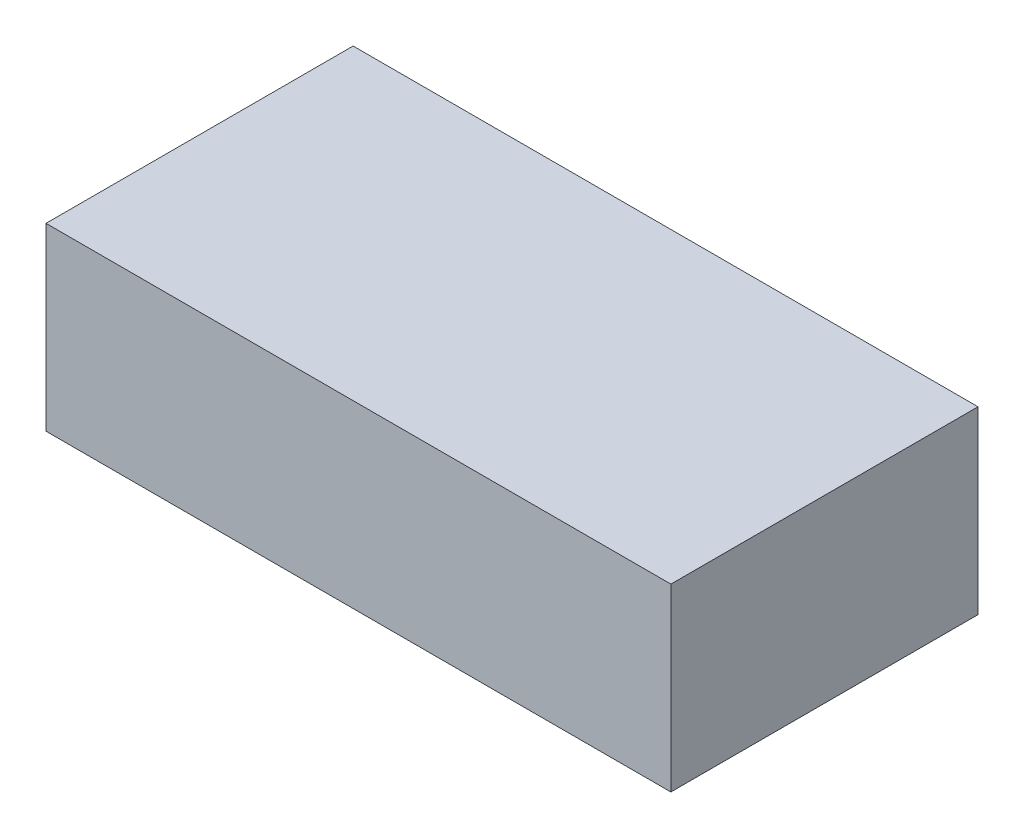
ISO-10303-21;
HEADER;
FILE_DESCRIPTION(('STEP AP214'),'2;1');
FILE_NAME('part.step','',(''),(''),'','','');
FILE_SCHEMA(('AUTOMOTIVE_DESIGN { 1 0 10303 214 1 1 1 1 }'));
ENDSEC;
DATA;
#1=APPLICATION_CONTEXT('core data for automotive mechanical design processes');
#2=APPLICATION_PROTOCOL_DEFINITION('international standard','automotive_design',2000,#1);
#3=PRODUCT_CONTEXT('',#1,'mechanical');
#4=PRODUCT('Part','Part','',(#3));
#5=PRODUCT_RELATED_PRODUCT_CATEGORY('part','',(#4));
#6=PRODUCT_DEFINITION_FORMATION('','',#4);
#7=PRODUCT_DEFINITION_CONTEXT('part definition',#1,'design');
#8=PRODUCT_DEFINITION('design','',#6,#7);
#9=PRODUCT_DEFINITION_SHAPE('','',#8);
#10=(LENGTH_UNIT() NAMED_UNIT(*) SI_UNIT(.MILLI.,.METRE.));
#11=(NAMED_UNIT(*) PLANE_ANGLE_UNIT() SI_UNIT($,.RADIAN.));
#12=(NAMED_UNIT(*) SI_UNIT($,.STERADIAN.) SOLID_ANGLE_UNIT());
#13=UNCERTAINTY_MEASURE_WITH_UNIT(LENGTH_MEASURE(1.E-05),#10,'distance_accuracy_value','');
#14=(GEOMETRIC_REPRESENTATION_CONTEXT(3) GLOBAL_UNCERTAINTY_ASSIGNED_CONTEXT((#13)) GLOBAL_UNIT_ASSIGNED_CONTEXT((#10,
#11,#12)) REPRESENTATION_CONTEXT('',''));
#15=CARTESIAN_POINT('',(0.,0.,0.));
#16=DIRECTION('',(0.,0.,1.));
#17=DIRECTION('',(1.,0.,0.));
#18=AXIS2_PLACEMENT_3D('',#15,#16,#17);
#19=CARTESIAN_POINT('',(59.,34.,29.));
#20=DIRECTION('',(-1.,0.,0.));
#21=DIRECTION('',(0.,0.,1.));
#22=AXIS2_PLACEMENT_3D('',#19,#20,#21);
#23=PLANE('',#22);
#24=DIRECTION('',(0.,0.,-1.));
#25=VECTOR('',#24,1.);
#26=CARTESIAN_POINT('',(59.,0.,29.));
#27=LINE('',#26,#25);
#28=CARTESIAN_POINT('',(59.,0.,29.));
#29=VERTEX_POINT('',#28);
#30=CARTESIAN_POINT('',(59.,0.,-29.));
#31=VERTEX_POINT('',#30);
#32=EDGE_CURVE('E99',#29,#31,#27,.T.);
#33=ORIENTED_EDGE('',*,*,#32,.T.);
#34=DIRECTION('',(0.,-1.,0.));
#35=VECTOR('',#34,1.);
#36=CARTESIAN_POINT('',(59.,34.,-29.));
#37=LINE('',#36,#35);
#38=CARTESIAN_POINT('',(59.,34.,-29.));
#39=VERTEX_POINT('',#38);
#40=EDGE_CURVE('E11',#39,#31,#37,.T.);
#41=ORIENTED_EDGE('',*,*,#40,.F.);
#42=DIRECTION('',(0.,0.,-1.));
#43=VECTOR('',#42,1.);
#44=CARTESIAN_POINT('',(59.,34.,29.));
#45=LINE('',#44,#43);
#46=CARTESIAN_POINT('',(59.,34.,29.));
#47=VERTEX_POINT('',#46);
#48=EDGE_CURVE('E87',#47,#39,#45,.T.);
#49=ORIENTED_EDGE('',*,*,#48,.F.);
#50=DIRECTION('',(0.,-1.,0.));
#51=VECTOR('',#50,1.);
#52=CARTESIAN_POINT('',(59.,34.,29.));
#53=LINE('',#52,#51);
#54=EDGE_CURVE('E95',#47,#29,#53,.T.);
#55=ORIENTED_EDGE('',*,*,#54,.T.);
#56=EDGE_LOOP('',(#33,#41,#49,#55));
#57=FACE_BOUND('',#56,.T.);
#58=ADVANCED_FACE('F36',(#57),#23,.F.);
#59=CARTESIAN_POINT('',(-59.,34.,-29.));
#60=DIRECTION('',(0.,0.,1.));
#61=DIRECTION('',(1.,0.,0.));
#62=AXIS2_PLACEMENT_3D('',#59,#60,#61);
#63=PLANE('',#62);
#64=DIRECTION('',(-1.,0.,0.));
#65=VECTOR('',#64,1.);
#66=CARTESIAN_POINT('',(-59.,0.,-29.));
#67=LINE('',#66,#65);
#68=CARTESIAN_POINT('',(-59.,0.,-29.));
#69=VERTEX_POINT('',#68);
#70=EDGE_CURVE('E91',#31,#69,#67,.T.);
#71=ORIENTED_EDGE('',*,*,#70,.T.);
#72=DIRECTION('',(0.,-1.,0.));
#73=VECTOR('',#72,1.);
#74=CARTESIAN_POINT('',(-59.,34.,-29.));
#75=LINE('',#74,#73);
#76=CARTESIAN_POINT('',(-59.,34.,-29.));
#77=VERTEX_POINT('',#76);
#78=EDGE_CURVE('E44',#77,#69,#75,.T.);
#79=ORIENTED_EDGE('',*,*,#78,.F.);
#80=DIRECTION('',(-1.,0.,0.));
#81=VECTOR('',#80,1.);
#82=CARTESIAN_POINT('',(-59.,34.,-29.));
#83=LINE('',#82,#81);
#84=EDGE_CURVE('E82',#39,#77,#83,.T.);
#85=ORIENTED_EDGE('',*,*,#84,.F.);
#86=ORIENTED_EDGE('',*,*,#40,.T.);
#87=EDGE_LOOP('',(#71,#79,#85,#86));
#88=FACE_BOUND('',#87,.T.);
#89=ADVANCED_FACE('F90',(#88),#63,.F.);
#90=CARTESIAN_POINT('',(-59.,34.,29.));
#91=DIRECTION('',(1.,0.,0.));
#92=DIRECTION('',(0.,0.,-1.));
#93=AXIS2_PLACEMENT_3D('',#90,#91,#92);
#94=PLANE('',#93);
#95=DIRECTION('',(0.,0.,1.));
#96=VECTOR('',#95,1.);
#97=CARTESIAN_POINT('',(-59.,0.,29.));
#98=LINE('',#97,#96);
#99=CARTESIAN_POINT('',(-59.,0.,29.));
#100=VERTEX_POINT('',#99);
#101=EDGE_CURVE('E69',#69,#100,#98,.T.);
#102=ORIENTED_EDGE('',*,*,#101,.T.);
#103=DIRECTION('',(0.,-1.,0.));
#104=VECTOR('',#103,1.);
#105=CARTESIAN_POINT('',(-59.,34.,29.));
#106=LINE('',#105,#104);
#107=CARTESIAN_POINT('',(-59.,34.,29.));
#108=VERTEX_POINT('',#107);
#109=EDGE_CURVE('E92',#108,#100,#106,.T.);
#110=ORIENTED_EDGE('',*,*,#109,.F.);
#111=DIRECTION('',(0.,0.,1.));
#112=VECTOR('',#111,1.);
#113=CARTESIAN_POINT('',(-59.,34.,29.));
#114=LINE('',#113,#112);
#115=EDGE_CURVE('E85',#77,#108,#114,.T.);
#116=ORIENTED_EDGE('',*,*,#115,.F.);
#117=ORIENTED_EDGE('',*,*,#78,.T.);
#118=EDGE_LOOP('',(#102,#110,#116,#117));
#119=FACE_BOUND('',#118,.T.);
#120=ADVANCED_FACE('F93',(#119),#94,.F.);
#121=CARTESIAN_POINT('',(-59.,34.,29.));
#122=DIRECTION('',(0.,0.,-1.));
#123=DIRECTION('',(-1.,0.,0.));
#124=AXIS2_PLACEMENT_3D('',#121,#122,#123);
#125=PLANE('',#124);
#126=DIRECTION('',(1.,0.,0.));
#127=VECTOR('',#126,1.);
#128=CARTESIAN_POINT('',(-59.,0.,29.));
#129=LINE('',#128,#127);
#130=EDGE_CURVE('E75',#100,#29,#129,.T.);
#131=ORIENTED_EDGE('',*,*,#130,.T.);
#132=ORIENTED_EDGE('',*,*,#54,.F.);
#133=DIRECTION('',(1.,0.,0.));
#134=VECTOR('',#133,1.);
#135=CARTESIAN_POINT('',(-59.,34.,29.));
#136=LINE('',#135,#134);
#137=EDGE_CURVE('E52',#108,#47,#136,.T.);
#138=ORIENTED_EDGE('',*,*,#137,.F.);
#139=ORIENTED_EDGE('',*,*,#109,.T.);
#140=EDGE_LOOP('',(#131,#132,#138,#139));
#141=FACE_BOUND('',#140,.T.);
#142=ADVANCED_FACE('F106',(#141),#125,.F.);
#143=CARTESIAN_POINT('',(0.,34.,0.));
#144=DIRECTION('',(0.,-1.,0.));
#145=DIRECTION('',(0.,0.,-1.));
#146=AXIS2_PLACEMENT_3D('',#143,#144,#145);
#147=PLANE('',#146);
#148=ORIENTED_EDGE('',*,*,#48,.T.);
#149=ORIENTED_EDGE('',*,*,#84,.T.);
#150=ORIENTED_EDGE('',*,*,#115,.T.);
#151=ORIENTED_EDGE('',*,*,#137,.T.);
#152=EDGE_LOOP('',(#148,#149,#150,#151));
#153=FACE_BOUND('',#152,.T.);
#154=ADVANCED_FACE('F83',(#153),#147,.F.);
#155=CARTESIAN_POINT('',(0.,0.,0.));
#156=DIRECTION('',(0.,-1.,0.));
#157=DIRECTION('',(0.,0.,-1.));
#158=AXIS2_PLACEMENT_3D('',#155,#156,#157);
#159=PLANE('',#158);
#160=ORIENTED_EDGE('',*,*,#32,.F.);
#161=ORIENTED_EDGE('',*,*,#130,.F.);
#162=ORIENTED_EDGE('',*,*,#101,.F.);
#163=ORIENTED_EDGE('',*,*,#70,.F.);
#164=EDGE_LOOP('',(#160,#161,#162,#163));
#165=FACE_BOUND('',#164,.T.);
#166=ADVANCED_FACE('F109',(#165),#159,.T.);
#167=CLOSED_SHELL('',(#58,#89,#120,#142,#154,#166));
#168=MANIFOLD_SOLID_BREP('B2',#167);
#169=ADVANCED_BREP_SHAPE_REPRESENTATION('',(#18,#168),#14);
#170=SHAPE_DEFINITION_REPRESENTATION(#9,#169);
ENDSEC;
END-ISO-10303-21;
